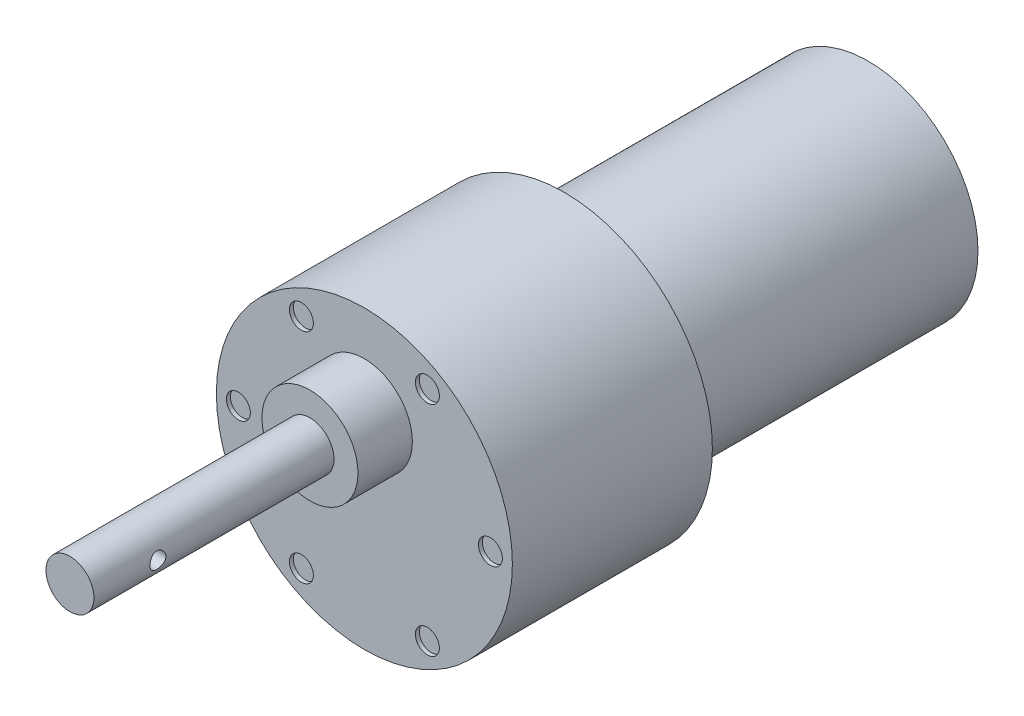
ISO-10303-21;
HEADER;
FILE_DESCRIPTION(('STEP AP214'),'2;1');
FILE_NAME('part.step','',(''),(''),'','','');
FILE_SCHEMA(('AUTOMOTIVE_DESIGN { 1 0 10303 214 1 1 1 1 }'));
ENDSEC;
DATA;
#1=APPLICATION_CONTEXT('core data for automotive mechanical design processes');
#2=APPLICATION_PROTOCOL_DEFINITION('international standard','automotive_design',2000,#1);
#3=PRODUCT_CONTEXT('',#1,'mechanical');
#4=PRODUCT('Part','Part','',(#3));
#5=PRODUCT_RELATED_PRODUCT_CATEGORY('part','',(#4));
#6=PRODUCT_DEFINITION_FORMATION('','',#4);
#7=PRODUCT_DEFINITION_CONTEXT('part definition',#1,'design');
#8=PRODUCT_DEFINITION('design','',#6,#7);
#9=PRODUCT_DEFINITION_SHAPE('','',#8);
#10=(LENGTH_UNIT() NAMED_UNIT(*) SI_UNIT(.MILLI.,.METRE.));
#11=(NAMED_UNIT(*) PLANE_ANGLE_UNIT() SI_UNIT($,.RADIAN.));
#12=(NAMED_UNIT(*) SI_UNIT($,.STERADIAN.) SOLID_ANGLE_UNIT());
#13=UNCERTAINTY_MEASURE_WITH_UNIT(LENGTH_MEASURE(1.E-05),#10,'distance_accuracy_value','');
#14=(GEOMETRIC_REPRESENTATION_CONTEXT(3) GLOBAL_UNCERTAINTY_ASSIGNED_CONTEXT((#13)) GLOBAL_UNIT_ASSIGNED_CONTEXT((#10,
#11,#12)) REPRESENTATION_CONTEXT('',''));
#15=CARTESIAN_POINT('',(0.,0.,0.));
#16=DIRECTION('',(0.,0.,1.));
#17=DIRECTION('',(1.,0.,0.));
#18=AXIS2_PLACEMENT_3D('',#15,#16,#17);
#19=CARTESIAN_POINT('',(0.,0.,38.));
#20=DIRECTION('',(0.,0.,-1.));
#21=DIRECTION('',(-1.,0.,0.));
#22=AXIS2_PLACEMENT_3D('',#19,#20,#21);
#23=CYLINDRICAL_SURFACE('',#22,13.7);
#24=CARTESIAN_POINT('',(0.,0.,38.));
#25=DIRECTION('',(0.,0.,1.));
#26=DIRECTION('',(1.,0.,0.));
#27=AXIS2_PLACEMENT_3D('',#24,#25,#26);
#28=CIRCLE('',#27,13.7);
#29=CARTESIAN_POINT('',(13.7,0.,38.));
#30=VERTEX_POINT('',#29);
#31=EDGE_CURVE('E10',#30,#30,#28,.T.);
#32=ORIENTED_EDGE('',*,*,#31,.F.);
#33=EDGE_LOOP('',(#32));
#34=FACE_BOUND('',#33,.T.);
#35=CARTESIAN_POINT('',(0.,0.,0.));
#36=DIRECTION('',(0.,0.,1.));
#37=DIRECTION('',(1.,0.,0.));
#38=AXIS2_PLACEMENT_3D('',#35,#36,#37);
#39=CIRCLE('',#38,13.7);
#40=CARTESIAN_POINT('',(13.7,0.,0.));
#41=VERTEX_POINT('',#40);
#42=EDGE_CURVE('E43',#41,#41,#39,.T.);
#43=ORIENTED_EDGE('',*,*,#42,.T.);
#44=EDGE_LOOP('',(#43));
#45=FACE_BOUND('',#44,.T.);
#46=ADVANCED_FACE('F32',(#34,#45),#23,.T.);
#47=CARTESIAN_POINT('',(0.,0.,0.));
#48=DIRECTION('',(0.,0.,1.));
#49=DIRECTION('',(1.,0.,0.));
#50=AXIS2_PLACEMENT_3D('',#47,#48,#49);
#51=PLANE('',#50);
#52=ORIENTED_EDGE('',*,*,#42,.F.);
#53=EDGE_LOOP('',(#52));
#54=FACE_BOUND('',#53,.T.);
#55=ADVANCED_FACE('F124',(#54),#51,.F.);
#56=CARTESIAN_POINT('',(0.,0.,63.));
#57=DIRECTION('',(0.,0.,-1.));
#58=DIRECTION('',(-1.,0.,0.));
#59=AXIS2_PLACEMENT_3D('',#56,#57,#58);
#60=CYLINDRICAL_SURFACE('',#59,18.5);
#61=CARTESIAN_POINT('',(0.,0.,63.));
#62=DIRECTION('',(0.,0.,1.));
#63=DIRECTION('',(1.,0.,0.));
#64=AXIS2_PLACEMENT_3D('',#61,#62,#63);
#65=CIRCLE('',#64,18.5);
#66=CARTESIAN_POINT('',(18.5,0.,63.));
#67=VERTEX_POINT('',#66);
#68=EDGE_CURVE('E48',#67,#67,#65,.T.);
#69=ORIENTED_EDGE('',*,*,#68,.F.);
#70=EDGE_LOOP('',(#69));
#71=FACE_BOUND('',#70,.T.);
#72=CARTESIAN_POINT('',(0.,0.,38.));
#73=DIRECTION('',(0.,0.,1.));
#74=DIRECTION('',(1.,0.,0.));
#75=AXIS2_PLACEMENT_3D('',#72,#73,#74);
#76=CIRCLE('',#75,18.5);
#77=CARTESIAN_POINT('',(18.5,0.,38.));
#78=VERTEX_POINT('',#77);
#79=EDGE_CURVE('E51',#78,#78,#76,.T.);
#80=ORIENTED_EDGE('',*,*,#79,.T.);
#81=EDGE_LOOP('',(#80));
#82=FACE_BOUND('',#81,.T.);
#83=ADVANCED_FACE('F129',(#71,#82),#60,.T.);
#84=CARTESIAN_POINT('',(0.,0.,63.));
#85=DIRECTION('',(0.,0.,1.));
#86=DIRECTION('',(1.,0.,0.));
#87=AXIS2_PLACEMENT_3D('',#84,#85,#86);
#88=PLANE('',#87);
#89=CARTESIAN_POINT('',(-7.87500000000016,-13.6399001096048,63.));
#90=DIRECTION('',(0.,0.,1.));
#91=DIRECTION('',(1.,0.,0.));
#92=AXIS2_PLACEMENT_3D('',#89,#90,#91);
#93=CIRCLE('',#92,1.5);
#94=CARTESIAN_POINT('',(-6.37500000000016,-13.6399001096048,63.));
#95=VERTEX_POINT('',#94);
#96=EDGE_CURVE('E206',#95,#95,#93,.T.);
#97=ORIENTED_EDGE('',*,*,#96,.F.);
#98=EDGE_LOOP('',(#97));
#99=FACE_BOUND('',#98,.T.);
#100=CARTESIAN_POINT('',(7.87499999999987,-13.639900109605,63.));
#101=DIRECTION('',(0.,0.,1.));
#102=DIRECTION('',(1.,0.,0.));
#103=AXIS2_PLACEMENT_3D('',#100,#101,#102);
#104=CIRCLE('',#103,1.5);
#105=CARTESIAN_POINT('',(9.37499999999987,-13.639900109605,63.));
#106=VERTEX_POINT('',#105);
#107=EDGE_CURVE('E200',#106,#106,#104,.T.);
#108=ORIENTED_EDGE('',*,*,#107,.F.);
#109=EDGE_LOOP('',(#108));
#110=FACE_BOUND('',#109,.T.);
#111=CARTESIAN_POINT('',(15.75,-1.09981662173559E-13,63.));
#112=DIRECTION('',(0.,0.,1.));
#113=DIRECTION('',(1.,0.,0.));
#114=AXIS2_PLACEMENT_3D('',#111,#112,#113);
#115=CIRCLE('',#114,1.5);
#116=CARTESIAN_POINT('',(17.25,-1.09981662173559E-13,63.));
#117=VERTEX_POINT('',#116);
#118=EDGE_CURVE('E194',#117,#117,#115,.T.);
#119=ORIENTED_EDGE('',*,*,#118,.F.);
#120=EDGE_LOOP('',(#119));
#121=FACE_BOUND('',#120,.T.);
#122=CARTESIAN_POINT('',(7.87500000000006,13.6399001096049,63.));
#123=DIRECTION('',(0.,0.,1.));
#124=DIRECTION('',(1.,0.,0.));
#125=AXIS2_PLACEMENT_3D('',#122,#123,#124);
#126=CIRCLE('',#125,1.5);
#127=CARTESIAN_POINT('',(9.37500000000007,13.6399001096049,63.));
#128=VERTEX_POINT('',#127);
#129=EDGE_CURVE('E188',#128,#128,#126,.T.);
#130=ORIENTED_EDGE('',*,*,#129,.F.);
#131=EDGE_LOOP('',(#130));
#132=FACE_BOUND('',#131,.T.);
#133=CARTESIAN_POINT('',(-7.87499999999997,13.6399001096049,63.));
#134=DIRECTION('',(0.,0.,1.));
#135=DIRECTION('',(1.,0.,0.));
#136=AXIS2_PLACEMENT_3D('',#133,#134,#135);
#137=CIRCLE('',#136,1.5);
#138=CARTESIAN_POINT('',(-6.37499999999997,13.6399001096049,63.));
#139=VERTEX_POINT('',#138);
#140=EDGE_CURVE('E182',#139,#139,#137,.T.);
#141=ORIENTED_EDGE('',*,*,#140,.F.);
#142=EDGE_LOOP('',(#141));
#143=FACE_BOUND('',#142,.T.);
#144=CARTESIAN_POINT('',(-15.75,0.,63.));
#145=DIRECTION('',(0.,0.,1.));
#146=DIRECTION('',(1.,0.,0.));
#147=AXIS2_PLACEMENT_3D('',#144,#145,#146);
#148=CIRCLE('',#147,1.5);
#149=CARTESIAN_POINT('',(-14.25,0.,63.));
#150=VERTEX_POINT('',#149);
#151=EDGE_CURVE('E176',#150,#150,#148,.T.);
#152=ORIENTED_EDGE('',*,*,#151,.F.);
#153=EDGE_LOOP('',(#152));
#154=FACE_BOUND('',#153,.T.);
#155=CARTESIAN_POINT('',(0.,7.,63.));
#156=DIRECTION('',(0.,0.,1.));
#157=DIRECTION('',(1.,0.,0.));
#158=AXIS2_PLACEMENT_3D('',#155,#156,#157);
#159=CIRCLE('',#158,6.);
#160=CARTESIAN_POINT('',(6.,7.,63.));
#161=VERTEX_POINT('',#160);
#162=EDGE_CURVE('E160',#161,#161,#159,.T.);
#163=ORIENTED_EDGE('',*,*,#162,.F.);
#164=EDGE_LOOP('',(#163));
#165=FACE_BOUND('',#164,.T.);
#166=ORIENTED_EDGE('',*,*,#68,.T.);
#167=EDGE_LOOP('',(#166));
#168=FACE_BOUND('',#167,.T.);
#169=ADVANCED_FACE('F136',(#99,#110,#121,#132,#143,#154,#165,#168),#88,.T.);
#170=CARTESIAN_POINT('',(0.,0.,38.));
#171=DIRECTION('',(0.,0.,1.));
#172=DIRECTION('',(1.,0.,0.));
#173=AXIS2_PLACEMENT_3D('',#170,#171,#172);
#174=PLANE('',#173);
#175=ORIENTED_EDGE('',*,*,#31,.T.);
#176=EDGE_LOOP('',(#175));
#177=FACE_BOUND('',#176,.T.);
#178=ORIENTED_EDGE('',*,*,#79,.F.);
#179=EDGE_LOOP('',(#178));
#180=FACE_BOUND('',#179,.T.);
#181=ADVANCED_FACE('F140',(#177,#180),#174,.F.);
#182=CARTESIAN_POINT('',(0.,7.,69.8));
#183=DIRECTION('',(0.,0.,-1.));
#184=DIRECTION('',(-1.,0.,0.));
#185=AXIS2_PLACEMENT_3D('',#182,#183,#184);
#186=CYLINDRICAL_SURFACE('',#185,6.);
#187=CARTESIAN_POINT('',(0.,7.,69.8));
#188=DIRECTION('',(0.,0.,1.));
#189=DIRECTION('',(1.,0.,0.));
#190=AXIS2_PLACEMENT_3D('',#187,#188,#189);
#191=CIRCLE('',#190,6.);
#192=CARTESIAN_POINT('',(6.,7.,69.8));
#193=VERTEX_POINT('',#192);
#194=EDGE_CURVE('E159',#193,#193,#191,.T.);
#195=ORIENTED_EDGE('',*,*,#194,.F.);
#196=EDGE_LOOP('',(#195));
#197=FACE_BOUND('',#196,.T.);
#198=ORIENTED_EDGE('',*,*,#162,.T.);
#199=EDGE_LOOP('',(#198));
#200=FACE_BOUND('',#199,.T.);
#201=ADVANCED_FACE('F143',(#197,#200),#186,.T.);
#202=CARTESIAN_POINT('',(0.,7.,69.8));
#203=DIRECTION('',(0.,0.,1.));
#204=DIRECTION('',(1.,0.,0.));
#205=AXIS2_PLACEMENT_3D('',#202,#203,#204);
#206=PLANE('',#205);
#207=CARTESIAN_POINT('',(0.,7.,69.8));
#208=DIRECTION('',(0.,0.,1.));
#209=DIRECTION('',(1.,0.,0.));
#210=AXIS2_PLACEMENT_3D('',#207,#208,#209);
#211=CIRCLE('',#210,3.);
#212=CARTESIAN_POINT('',(3.,7.,69.8));
#213=VERTEX_POINT('',#212);
#214=EDGE_CURVE('E156',#213,#213,#211,.T.);
#215=ORIENTED_EDGE('',*,*,#214,.F.);
#216=EDGE_LOOP('',(#215));
#217=FACE_BOUND('',#216,.T.);
#218=ORIENTED_EDGE('',*,*,#194,.T.);
#219=EDGE_LOOP('',(#218));
#220=FACE_BOUND('',#219,.T.);
#221=ADVANCED_FACE('F120',(#217,#220),#206,.T.);
#222=CARTESIAN_POINT('',(0.,7.,99.8));
#223=DIRECTION('',(0.,0.,-1.));
#224=DIRECTION('',(-1.,0.,0.));
#225=AXIS2_PLACEMENT_3D('',#222,#223,#224);
#226=CYLINDRICAL_SURFACE('',#225,3.);
#227=CARTESIAN_POINT('',(-3.,7.,92.8));
#228=CARTESIAN_POINT('',(-3.00000015300943,6.94543663711328,92.8000002537316));
#229=CARTESIAN_POINT('',(-2.99849769507545,6.89087480546145,92.7955197338728));
#230=CARTESIAN_POINT('',(-2.99265210203281,6.78335823912703,92.7777708911828));
#231=CARTESIAN_POINT('',(-2.98830867202153,6.73040367188118,92.7645016560511));
#232=CARTESIAN_POINT('',(-2.97725307906443,6.62766721049823,92.7296807566159));
#233=CARTESIAN_POINT('',(-2.97054487730853,6.57788017411397,92.7081429375407));
#234=CARTESIAN_POINT('',(-2.95544445717342,6.48262506319468,92.6574588271616));
#235=CARTESIAN_POINT('',(-2.94705190667778,6.43715784304129,92.6283110349974));
#236=CARTESIAN_POINT('',(-2.92914094443005,6.35025832497774,92.5621741951413));
#237=CARTESIAN_POINT('',(-2.91959556463785,6.3089962997017,92.5249687657395));
#238=CARTESIAN_POINT('',(-2.90060314783122,6.23316730729792,92.4442328452934));
#239=CARTESIAN_POINT('',(-2.89115613290549,6.19860181451054,92.4007009650715));
#240=CARTESIAN_POINT('',(-2.87313332477274,6.13617505777214,92.3070148848035));
#241=CARTESIAN_POINT('',(-2.86459039275688,6.10853514177897,92.2567062602679));
#242=CARTESIAN_POINT('',(-2.84975305418601,6.06218112612228,92.1518239055414));
#243=CARTESIAN_POINT('',(-2.84345796160746,6.04346430261324,92.0972514828373));
#244=CARTESIAN_POINT('',(-2.83411303269377,6.01612653849084,91.9873267785033));
#245=CARTESIAN_POINT('',(-2.83096095769611,6.00718655172823,91.9320627915109));
#246=CARTESIAN_POINT('',(-2.82795656629508,5.99865887666552,91.8207362458441));
#247=CARTESIAN_POINT('',(-2.8281032302273,5.99906829839528,91.7646739392908));
#248=CARTESIAN_POINT('',(-2.8315901500818,6.00898009629658,91.656063369556));
#249=CARTESIAN_POINT('',(-2.83478415867533,6.01806608683301,91.603471597081));
#250=CARTESIAN_POINT('',(-2.84376657724551,6.04439383715059,91.5006065803932));
#251=CARTESIAN_POINT('',(-2.84955529784108,6.06163657340813,91.4503336145649));
#252=CARTESIAN_POINT('',(-2.86317911131249,6.10406094193979,91.3525872504085));
#253=CARTESIAN_POINT('',(-2.87104565793117,6.12936595129274,91.3051719745305));
#254=CARTESIAN_POINT('',(-2.88792558575726,6.18711089369686,91.2151290917203));
#255=CARTESIAN_POINT('',(-2.89693929790464,6.219552887636,91.1725028730666));
#256=CARTESIAN_POINT('',(-2.91567329167741,6.29265066731776,91.0909084018392));
#257=CARTESIAN_POINT('',(-2.92540589354843,6.33364684992369,91.0522473054909));
#258=CARTESIAN_POINT('',(-2.94406938387037,6.42166043002994,90.9822687333366));
#259=CARTESIAN_POINT('',(-2.95300019538067,6.46867840433919,90.9509519618355));
#260=CARTESIAN_POINT('',(-2.96917107937794,6.56805238695374,90.8963036997649));
#261=CARTESIAN_POINT('',(-2.97639350008039,6.62045672358366,90.8730545086593));
#262=CARTESIAN_POINT('',(-2.98820567144435,6.72873091663549,90.8357968260443));
#263=CARTESIAN_POINT('',(-2.99279633654878,6.78459956184504,90.8217851245766));
#264=CARTESIAN_POINT('',(-2.99867627071441,6.89561617047069,90.8039443339777));
#265=CARTESIAN_POINT('',(-3.00010001833731,6.95069040013515,90.7997001908273));
#266=CARTESIAN_POINT('',(-2.99988902694825,7.06077506996023,90.8003326735985));
#267=CARTESIAN_POINT('',(-2.99825480419352,7.11578551931965,90.8052077599799));
#268=CARTESIAN_POINT('',(-2.99220024717114,7.22251986630426,90.823611907736));
#269=CARTESIAN_POINT('',(-2.98786198711228,7.27429280683486,90.8368862060495));
#270=CARTESIAN_POINT('',(-2.97691846830034,7.37485595857956,90.8713934444667));
#271=CARTESIAN_POINT('',(-2.97031292046541,7.42364578850856,90.8926273994677));
#272=CARTESIAN_POINT('',(-2.95528931287427,7.51828829639332,90.9430704318409));
#273=CARTESIAN_POINT('',(-2.94682814756305,7.56402995921733,90.9724745932836));
#274=CARTESIAN_POINT('',(-2.92905253915743,7.6500648301354,91.038194150013));
#275=CARTESIAN_POINT('',(-2.91973783591888,7.69035636779489,91.0745116560302));
#276=CARTESIAN_POINT('',(-2.90076847982472,7.76625250780701,91.1549787510083));
#277=CARTESIAN_POINT('',(-2.89111761095155,7.80156096924849,91.1994092269332));
#278=CARTESIAN_POINT('',(-2.87299973286981,7.86425752232085,91.2937715678045));
#279=CARTESIAN_POINT('',(-2.8645327335312,7.89164554792084,91.3437034786102));
#280=CARTESIAN_POINT('',(-2.84982391820308,7.93759693042336,91.4476730153066));
#281=CARTESIAN_POINT('',(-2.84357760900632,7.95617813219776,91.5017020792428));
#282=CARTESIAN_POINT('',(-2.83410832399133,7.98389466679216,91.6123786501241));
#283=CARTESIAN_POINT('',(-2.83088398622698,7.99303425496124,91.669024965433));
#284=CARTESIAN_POINT('',(-2.82797858875071,8.00127628247038,91.7801970960132));
#285=CARTESIAN_POINT('',(-2.82812400344299,8.00087025731093,91.8346823402517));
#286=CARTESIAN_POINT('',(-2.8315126992356,7.99124229345488,91.9427650748997));
#287=CARTESIAN_POINT('',(-2.83475579595884,7.98202087945889,91.9963626179529));
#288=CARTESIAN_POINT('',(-2.84384524278943,7.95537181312698,92.1001356630127));
#289=CARTESIAN_POINT('',(-2.84964098015514,7.93810334601488,92.1503568250072));
#290=CARTESIAN_POINT('',(-2.86316398825434,7.89597936576038,92.2472274069355));
#291=CARTESIAN_POINT('',(-2.87089168765297,7.87112216855397,92.2938760311873));
#292=CARTESIAN_POINT('',(-2.8878282922406,7.81326069258324,92.3844836699237));
#293=CARTESIAN_POINT('',(-2.89708711641604,7.77994824276453,92.4282365018986));
#294=CARTESIAN_POINT('',(-2.91583356283786,7.7066428831357,92.509689813384));
#295=CARTESIAN_POINT('',(-2.92532124912518,7.6666480844515,92.547388575688));
#296=CARTESIAN_POINT('',(-2.94390030525393,7.57924155692068,92.6171444122892));
#297=CARTESIAN_POINT('',(-2.95296181801216,7.53160151349972,92.648924347751));
#298=CARTESIAN_POINT('',(-2.96925991172652,7.43135735740663,92.7039904288506));
#299=CARTESIAN_POINT('',(-2.9764969590794,7.37875451813235,92.727278745922));
#300=CARTESIAN_POINT('',(-2.98805515068532,7.27249364720097,92.7637216324887));
#301=CARTESIAN_POINT('',(-2.9924921242252,7.21898775767641,92.7772824662634));
#302=CARTESIAN_POINT('',(-2.99846407064225,7.11032041601025,92.7954202806771));
#303=CARTESIAN_POINT('',(-2.99999984531906,7.05515942556875,92.7999997434965));
#304=CARTESIAN_POINT('',(-3.,7.,92.8));
#305=B_SPLINE_CURVE_WITH_KNOTS('',3,(#227,#228,#229,#230,#231,#232,#233,#234,#235,#236,#237,
#238,#239,#240,#241,#242,#243,#244,#245,#246,#247,#248,#249,#250,#251,#252,#253,#254,#255,#256,
#257,#258,#259,#260,#261,#262,#263,#264,#265,#266,#267,#268,#269,#270,#271,#272,#273,#274,#275,
#276,#277,#278,#279,#280,#281,#282,#283,#284,#285,#286,#287,#288,#289,#290,#291,#292,#293,#294,
#295,#296,#297,#298,#299,#300,#301,#302,#303,#304),.UNSPECIFIED.,.T.,.F.,(4,2,2,2,2,2,2,2,2,2,2,
2,2,2,2,2,2,2,2,2,2,2,2,2,2,2,2,2,2,2,2,2,2,2,2,2,2,2,4),(0.,0.163487106026012,0.32699118526752,
0.490222672870267,0.653486377799098,0.821846842827545,0.990244332875297,1.1634838482347,
1.33667044692833,1.50401925741839,1.67131633987485,1.83096826551281,1.99063930855482,
2.15288171155131,2.31517102558207,2.48593305811367,2.65671145966619,2.82918405650357,
3.00159668877208,3.16653583175169,3.33144713164176,3.49158157978213,3.65173645284104,
3.81610399843736,3.98052180821891,4.15241022880751,4.32430008234996,4.49584013824415,
4.66730284700844,4.82995666056617,4.99260079341184,5.15215587070227,5.31174638165788,
5.47830066681614,5.64490211113588,5.81799660824909,5.99104681142266,6.15636558363623,
6.32163866027949),.UNSPECIFIED.);
#306=CARTESIAN_POINT('',(-3.,7.,92.8));
#307=VERTEX_POINT('',#306);
#308=EDGE_CURVE('E35',#307,#307,#305,.T.);
#309=ORIENTED_EDGE('',*,*,#308,.T.);
#310=EDGE_LOOP('',(#309));
#311=FACE_BOUND('',#310,.T.);
#312=CARTESIAN_POINT('',(3.,7.,90.8));
#313=CARTESIAN_POINT('',(3.00000015300943,6.94543663711328,90.7999997462684));
#314=CARTESIAN_POINT('',(2.99849769507545,6.89087480546145,90.8044802661272));
#315=CARTESIAN_POINT('',(2.99265210203281,6.78335823912703,90.8222291088172));
#316=CARTESIAN_POINT('',(2.98830867202153,6.73040367188118,90.8354983439489));
#317=CARTESIAN_POINT('',(2.97725307906443,6.62766721049823,90.870319243384));
#318=CARTESIAN_POINT('',(2.97054487730853,6.57788017411397,90.8918570624593));
#319=CARTESIAN_POINT('',(2.95544445717342,6.48262506319468,90.9425411728383));
#320=CARTESIAN_POINT('',(2.94705190667778,6.43715784304129,90.9716889650026));
#321=CARTESIAN_POINT('',(2.92914094443005,6.35025832497773,91.0378258048587));
#322=CARTESIAN_POINT('',(2.91959556463785,6.30899629970169,91.0750312342605));
#323=CARTESIAN_POINT('',(2.90060314783122,6.23316730729792,91.1557671547066));
#324=CARTESIAN_POINT('',(2.89115613290549,6.19860181451054,91.1992990349285));
#325=CARTESIAN_POINT('',(2.87313332477274,6.13617505777214,91.2929851151964));
#326=CARTESIAN_POINT('',(2.86459039275688,6.10853514177897,91.3432937397321));
#327=CARTESIAN_POINT('',(2.84975305418601,6.06218112612228,91.4481760944585));
#328=CARTESIAN_POINT('',(2.84345796160746,6.04346430261324,91.5027485171627));
#329=CARTESIAN_POINT('',(2.83411303269377,6.01612653849084,91.6126732214967));
#330=CARTESIAN_POINT('',(2.83096095769611,6.00718655172823,91.6679372084891));
#331=CARTESIAN_POINT('',(2.82795656629508,5.99865887666552,91.7792637541559));
#332=CARTESIAN_POINT('',(2.8281032302273,5.99906829839528,91.8353260607092));
#333=CARTESIAN_POINT('',(2.8315901500818,6.00898009629658,91.943936630444));
#334=CARTESIAN_POINT('',(2.83478415867533,6.01806608683301,91.996528402919));
#335=CARTESIAN_POINT('',(2.84376657724551,6.04439383715059,92.0993934196068));
#336=CARTESIAN_POINT('',(2.84955529784108,6.06163657340813,92.1496663854351));
#337=CARTESIAN_POINT('',(2.86317911131249,6.10406094193979,92.2474127495915));
#338=CARTESIAN_POINT('',(2.87104565793117,6.12936595129274,92.2948280254695));
#339=CARTESIAN_POINT('',(2.88792558575726,6.18711089369686,92.3848709082797));
#340=CARTESIAN_POINT('',(2.89693929790464,6.219552887636,92.4274971269334));
#341=CARTESIAN_POINT('',(2.91567329167741,6.29265066731776,92.5090915981608));
#342=CARTESIAN_POINT('',(2.92540589354843,6.33364684992369,92.5477526945091));
#343=CARTESIAN_POINT('',(2.94406938387037,6.42166043002994,92.6177312666634));
#344=CARTESIAN_POINT('',(2.95300019538067,6.46867840433919,92.6490480381645));
#345=CARTESIAN_POINT('',(2.96917107937794,6.56805238695374,92.7036963002351));
#346=CARTESIAN_POINT('',(2.97639350008039,6.62045672358366,92.7269454913407));
#347=CARTESIAN_POINT('',(2.98820567144435,6.72873091663549,92.7642031739557));
#348=CARTESIAN_POINT('',(2.99279633654878,6.78459956184504,92.7782148754234));
#349=CARTESIAN_POINT('',(2.99867627071441,6.89561617047069,92.7960556660223));
#350=CARTESIAN_POINT('',(3.00010001833731,6.95069040013515,92.8002998091727));
#351=CARTESIAN_POINT('',(2.99988902694825,7.06077506996023,92.7996673264015));
#352=CARTESIAN_POINT('',(2.99825480419352,7.11578551931965,92.7947922400201));
#353=CARTESIAN_POINT('',(2.99220024717114,7.22251986630426,92.776388092264));
#354=CARTESIAN_POINT('',(2.98786198711228,7.27429280683486,92.7631137939505));
#355=CARTESIAN_POINT('',(2.97691846830034,7.37485595857956,92.7286065555333));
#356=CARTESIAN_POINT('',(2.97031292046541,7.42364578850856,92.7073726005323));
#357=CARTESIAN_POINT('',(2.95528931287427,7.51828829639332,92.6569295681591));
#358=CARTESIAN_POINT('',(2.94682814756305,7.56402995921733,92.6275254067164));
#359=CARTESIAN_POINT('',(2.92905253915743,7.6500648301354,92.5618058499869));
#360=CARTESIAN_POINT('',(2.91973783591888,7.69035636779489,92.5254883439698));
#361=CARTESIAN_POINT('',(2.90076847982472,7.76625250780701,92.4450212489917));
#362=CARTESIAN_POINT('',(2.89111761095155,7.80156096924849,92.4005907730667));
#363=CARTESIAN_POINT('',(2.87299973286981,7.86425752232085,92.3062284321955));
#364=CARTESIAN_POINT('',(2.8645327335312,7.89164554792084,92.2562965213898));
#365=CARTESIAN_POINT('',(2.84982391820308,7.93759693042336,92.1523269846934));
#366=CARTESIAN_POINT('',(2.84357760900632,7.95617813219776,92.0982979207572));
#367=CARTESIAN_POINT('',(2.83410832399133,7.98389466679216,91.9876213498759));
#368=CARTESIAN_POINT('',(2.83088398622698,7.99303425496124,91.9309750345669));
#369=CARTESIAN_POINT('',(2.82797858875071,8.00127628247038,91.8198029039868));
#370=CARTESIAN_POINT('',(2.82812400344299,8.00087025731093,91.7653176597483));
#371=CARTESIAN_POINT('',(2.8315126992356,7.99124229345488,91.6572349251003));
#372=CARTESIAN_POINT('',(2.83475579595884,7.98202087945889,91.6036373820471));
#373=CARTESIAN_POINT('',(2.84384524278943,7.95537181312698,91.4998643369873));
#374=CARTESIAN_POINT('',(2.84964098015514,7.93810334601488,91.4496431749928));
#375=CARTESIAN_POINT('',(2.86316398825434,7.89597936576038,91.3527725930645));
#376=CARTESIAN_POINT('',(2.87089168765297,7.87112216855397,91.3061239688127));
#377=CARTESIAN_POINT('',(2.8878282922406,7.81326069258324,91.2155163300763));
#378=CARTESIAN_POINT('',(2.89708711641604,7.77994824276453,91.1717634981014));
#379=CARTESIAN_POINT('',(2.91583356283786,7.7066428831357,91.090310186616));
#380=CARTESIAN_POINT('',(2.92532124912518,7.6666480844515,91.052611424312));
#381=CARTESIAN_POINT('',(2.94390030525393,7.57924155692068,90.9828555877108));
#382=CARTESIAN_POINT('',(2.95296181801216,7.53160151349972,90.951075652249));
#383=CARTESIAN_POINT('',(2.96925991172652,7.43135735740663,90.8960095711494));
#384=CARTESIAN_POINT('',(2.9764969590794,7.37875451813235,90.872721254078));
#385=CARTESIAN_POINT('',(2.98805515068532,7.27249364720097,90.8362783675113));
#386=CARTESIAN_POINT('',(2.9924921242252,7.21898775767641,90.8227175337366));
#387=CARTESIAN_POINT('',(2.99846407064225,7.11032041601025,90.8045797193229));
#388=CARTESIAN_POINT('',(2.99999984531906,7.05515942556875,90.8000002565035));
#389=CARTESIAN_POINT('',(3.,7.,90.8));
#390=B_SPLINE_CURVE_WITH_KNOTS('',3,(#312,#313,#314,#315,#316,#317,#318,#319,#320,#321,#322,
#323,#324,#325,#326,#327,#328,#329,#330,#331,#332,#333,#334,#335,#336,#337,#338,#339,#340,#341,
#342,#343,#344,#345,#346,#347,#348,#349,#350,#351,#352,#353,#354,#355,#356,#357,#358,#359,#360,
#361,#362,#363,#364,#365,#366,#367,#368,#369,#370,#371,#372,#373,#374,#375,#376,#377,#378,#379,
#380,#381,#382,#383,#384,#385,#386,#387,#388,#389),.UNSPECIFIED.,.T.,.F.,(4,2,2,2,2,2,2,2,2,2,2,
2,2,2,2,2,2,2,2,2,2,2,2,2,2,2,2,2,2,2,2,2,2,2,2,2,2,2,4),(0.,0.163487106026012,0.32699118526752,
0.490222672870267,0.653486377799098,0.821846842827559,0.990244332875296,1.1634838482347,
1.33667044692833,1.50401925741839,1.67131633987485,1.83096826551281,1.99063930855482,
2.15288171155131,2.31517102558207,2.48593305811367,2.65671145966619,2.82918405650357,
3.00159668877208,3.16653583175169,3.33144713164176,3.49158157978213,3.65173645284103,
3.81610399843736,3.98052180821891,4.15241022880751,4.32430008234996,4.49584013824415,
4.66730284700844,4.82995666056617,4.99260079341184,5.15215587070227,5.31174638165788,
5.47830066681614,5.64490211113588,5.81799660824909,5.99104681142266,6.15636558363623,
6.32163866027949),.UNSPECIFIED.);
#391=CARTESIAN_POINT('',(3.,7.,90.8));
#392=VERTEX_POINT('',#391);
#393=EDGE_CURVE('E53',#392,#392,#390,.T.);
#394=ORIENTED_EDGE('',*,*,#393,.T.);
#395=EDGE_LOOP('',(#394));
#396=FACE_BOUND('',#395,.T.);
#397=CARTESIAN_POINT('',(0.,7.,99.8));
#398=DIRECTION('',(0.,0.,1.));
#399=DIRECTION('',(1.,0.,0.));
#400=AXIS2_PLACEMENT_3D('',#397,#398,#399);
#401=CIRCLE('',#400,3.);
#402=CARTESIAN_POINT('',(3.,7.,99.8));
#403=VERTEX_POINT('',#402);
#404=EDGE_CURVE('E164',#403,#403,#401,.T.);
#405=ORIENTED_EDGE('',*,*,#404,.F.);
#406=EDGE_LOOP('',(#405));
#407=FACE_BOUND('',#406,.T.);
#408=ORIENTED_EDGE('',*,*,#214,.T.);
#409=EDGE_LOOP('',(#408));
#410=FACE_BOUND('',#409,.T.);
#411=ADVANCED_FACE('F57',(#311,#396,#407,#410),#226,.T.);
#412=CARTESIAN_POINT('',(0.,7.,99.8));
#413=DIRECTION('',(0.,0.,1.));
#414=DIRECTION('',(1.,0.,0.));
#415=AXIS2_PLACEMENT_3D('',#412,#413,#414);
#416=PLANE('',#415);
#417=ORIENTED_EDGE('',*,*,#404,.T.);
#418=EDGE_LOOP('',(#417));
#419=FACE_BOUND('',#418,.T.);
#420=ADVANCED_FACE('F113',(#419),#416,.T.);
#421=CARTESIAN_POINT('',(-15.75,0.,62.5));
#422=DIRECTION('',(0.,0.,1.));
#423=DIRECTION('',(1.,0.,0.));
#424=AXIS2_PLACEMENT_3D('',#421,#422,#423);
#425=CYLINDRICAL_SURFACE('',#424,1.5);
#426=CARTESIAN_POINT('',(-15.75,0.,62.5));
#427=DIRECTION('',(0.,0.,1.));
#428=DIRECTION('',(1.,0.,0.));
#429=AXIS2_PLACEMENT_3D('',#426,#427,#428);
#430=CIRCLE('',#429,1.5);
#431=CARTESIAN_POINT('',(-14.25,0.,62.5));
#432=VERTEX_POINT('',#431);
#433=EDGE_CURVE('E174',#432,#432,#430,.T.);
#434=ORIENTED_EDGE('',*,*,#433,.F.);
#435=EDGE_LOOP('',(#434));
#436=FACE_BOUND('',#435,.T.);
#437=ORIENTED_EDGE('',*,*,#151,.T.);
#438=EDGE_LOOP('',(#437));
#439=FACE_BOUND('',#438,.T.);
#440=ADVANCED_FACE('F110',(#436,#439),#425,.F.);
#441=CARTESIAN_POINT('',(-15.75,0.,62.5));
#442=DIRECTION('',(0.,0.,1.));
#443=DIRECTION('',(1.,0.,0.));
#444=AXIS2_PLACEMENT_3D('',#441,#442,#443);
#445=PLANE('',#444);
#446=ORIENTED_EDGE('',*,*,#433,.T.);
#447=EDGE_LOOP('',(#446));
#448=FACE_BOUND('',#447,.T.);
#449=ADVANCED_FACE('F106',(#448),#445,.T.);
#450=CARTESIAN_POINT('',(-7.87499999999997,13.6399001096049,62.5));
#451=DIRECTION('',(0.,0.,1.));
#452=DIRECTION('',(1.,0.,0.));
#453=AXIS2_PLACEMENT_3D('',#450,#451,#452);
#454=CYLINDRICAL_SURFACE('',#453,1.5);
#455=CARTESIAN_POINT('',(-7.87499999999997,13.6399001096049,62.5));
#456=DIRECTION('',(0.,0.,1.));
#457=DIRECTION('',(1.,0.,0.));
#458=AXIS2_PLACEMENT_3D('',#455,#456,#457);
#459=CIRCLE('',#458,1.5);
#460=CARTESIAN_POINT('',(-6.37499999999997,13.6399001096049,62.5));
#461=VERTEX_POINT('',#460);
#462=EDGE_CURVE('E179',#461,#461,#459,.T.);
#463=ORIENTED_EDGE('',*,*,#462,.F.);
#464=EDGE_LOOP('',(#463));
#465=FACE_BOUND('',#464,.T.);
#466=ORIENTED_EDGE('',*,*,#140,.T.);
#467=EDGE_LOOP('',(#466));
#468=FACE_BOUND('',#467,.T.);
#469=ADVANCED_FACE('F102',(#465,#468),#454,.F.);
#470=CARTESIAN_POINT('',(-7.87499999999997,13.6399001096049,62.5));
#471=DIRECTION('',(0.,0.,1.));
#472=DIRECTION('',(1.,0.,0.));
#473=AXIS2_PLACEMENT_3D('',#470,#471,#472);
#474=PLANE('',#473);
#475=ORIENTED_EDGE('',*,*,#462,.T.);
#476=EDGE_LOOP('',(#475));
#477=FACE_BOUND('',#476,.T.);
#478=ADVANCED_FACE('F98',(#477),#474,.T.);
#479=CARTESIAN_POINT('',(7.87500000000006,13.6399001096049,62.5));
#480=DIRECTION('',(0.,0.,1.));
#481=DIRECTION('',(1.,0.,0.));
#482=AXIS2_PLACEMENT_3D('',#479,#480,#481);
#483=CYLINDRICAL_SURFACE('',#482,1.5);
#484=CARTESIAN_POINT('',(7.87500000000006,13.6399001096049,62.5));
#485=DIRECTION('',(0.,0.,1.));
#486=DIRECTION('',(1.,0.,0.));
#487=AXIS2_PLACEMENT_3D('',#484,#485,#486);
#488=CIRCLE('',#487,1.5);
#489=CARTESIAN_POINT('',(9.37500000000007,13.6399001096049,62.5));
#490=VERTEX_POINT('',#489);
#491=EDGE_CURVE('E185',#490,#490,#488,.T.);
#492=ORIENTED_EDGE('',*,*,#491,.F.);
#493=EDGE_LOOP('',(#492));
#494=FACE_BOUND('',#493,.T.);
#495=ORIENTED_EDGE('',*,*,#129,.T.);
#496=EDGE_LOOP('',(#495));
#497=FACE_BOUND('',#496,.T.);
#498=ADVANCED_FACE('F94',(#494,#497),#483,.F.);
#499=CARTESIAN_POINT('',(7.87500000000006,13.6399001096049,62.5));
#500=DIRECTION('',(0.,0.,1.));
#501=DIRECTION('',(1.,0.,0.));
#502=AXIS2_PLACEMENT_3D('',#499,#500,#501);
#503=PLANE('',#502);
#504=ORIENTED_EDGE('',*,*,#491,.T.);
#505=EDGE_LOOP('',(#504));
#506=FACE_BOUND('',#505,.T.);
#507=ADVANCED_FACE('F90',(#506),#503,.T.);
#508=CARTESIAN_POINT('',(15.75,-1.09981662173559E-13,62.5));
#509=DIRECTION('',(0.,0.,1.));
#510=DIRECTION('',(1.,0.,0.));
#511=AXIS2_PLACEMENT_3D('',#508,#509,#510);
#512=CYLINDRICAL_SURFACE('',#511,1.5);
#513=CARTESIAN_POINT('',(15.75,-1.09981662173559E-13,62.5));
#514=DIRECTION('',(0.,0.,1.));
#515=DIRECTION('',(1.,0.,0.));
#516=AXIS2_PLACEMENT_3D('',#513,#514,#515);
#517=CIRCLE('',#516,1.5);
#518=CARTESIAN_POINT('',(17.25,-1.09981662173559E-13,62.5));
#519=VERTEX_POINT('',#518);
#520=EDGE_CURVE('E191',#519,#519,#517,.T.);
#521=ORIENTED_EDGE('',*,*,#520,.F.);
#522=EDGE_LOOP('',(#521));
#523=FACE_BOUND('',#522,.T.);
#524=ORIENTED_EDGE('',*,*,#118,.T.);
#525=EDGE_LOOP('',(#524));
#526=FACE_BOUND('',#525,.T.);
#527=ADVANCED_FACE('F86',(#523,#526),#512,.F.);
#528=CARTESIAN_POINT('',(15.75,-1.09981662173559E-13,62.5));
#529=DIRECTION('',(0.,0.,1.));
#530=DIRECTION('',(1.,0.,0.));
#531=AXIS2_PLACEMENT_3D('',#528,#529,#530);
#532=PLANE('',#531);
#533=ORIENTED_EDGE('',*,*,#520,.T.);
#534=EDGE_LOOP('',(#533));
#535=FACE_BOUND('',#534,.T.);
#536=ADVANCED_FACE('F82',(#535),#532,.T.);
#537=CARTESIAN_POINT('',(7.87499999999987,-13.639900109605,62.5));
#538=DIRECTION('',(0.,0.,1.));
#539=DIRECTION('',(1.,0.,0.));
#540=AXIS2_PLACEMENT_3D('',#537,#538,#539);
#541=CYLINDRICAL_SURFACE('',#540,1.5);
#542=CARTESIAN_POINT('',(7.87499999999987,-13.639900109605,62.5));
#543=DIRECTION('',(0.,0.,1.));
#544=DIRECTION('',(1.,0.,0.));
#545=AXIS2_PLACEMENT_3D('',#542,#543,#544);
#546=CIRCLE('',#545,1.5);
#547=CARTESIAN_POINT('',(9.37499999999987,-13.639900109605,62.5));
#548=VERTEX_POINT('',#547);
#549=EDGE_CURVE('E197',#548,#548,#546,.T.);
#550=ORIENTED_EDGE('',*,*,#549,.F.);
#551=EDGE_LOOP('',(#550));
#552=FACE_BOUND('',#551,.T.);
#553=ORIENTED_EDGE('',*,*,#107,.T.);
#554=EDGE_LOOP('',(#553));
#555=FACE_BOUND('',#554,.T.);
#556=ADVANCED_FACE('F78',(#552,#555),#541,.F.);
#557=CARTESIAN_POINT('',(7.87499999999987,-13.639900109605,62.5));
#558=DIRECTION('',(0.,0.,1.));
#559=DIRECTION('',(1.,0.,0.));
#560=AXIS2_PLACEMENT_3D('',#557,#558,#559);
#561=PLANE('',#560);
#562=ORIENTED_EDGE('',*,*,#549,.T.);
#563=EDGE_LOOP('',(#562));
#564=FACE_BOUND('',#563,.T.);
#565=ADVANCED_FACE('F74',(#564),#561,.T.);
#566=CARTESIAN_POINT('',(-7.87500000000016,-13.6399001096048,62.5));
#567=DIRECTION('',(0.,0.,1.));
#568=DIRECTION('',(1.,0.,0.));
#569=AXIS2_PLACEMENT_3D('',#566,#567,#568);
#570=CYLINDRICAL_SURFACE('',#569,1.5);
#571=CARTESIAN_POINT('',(-7.87500000000016,-13.6399001096048,62.5));
#572=DIRECTION('',(0.,0.,1.));
#573=DIRECTION('',(1.,0.,0.));
#574=AXIS2_PLACEMENT_3D('',#571,#572,#573);
#575=CIRCLE('',#574,1.5);
#576=CARTESIAN_POINT('',(-6.37500000000016,-13.6399001096048,62.5));
#577=VERTEX_POINT('',#576);
#578=EDGE_CURVE('E203',#577,#577,#575,.T.);
#579=ORIENTED_EDGE('',*,*,#578,.F.);
#580=EDGE_LOOP('',(#579));
#581=FACE_BOUND('',#580,.T.);
#582=ORIENTED_EDGE('',*,*,#96,.T.);
#583=EDGE_LOOP('',(#582));
#584=FACE_BOUND('',#583,.T.);
#585=ADVANCED_FACE('F70',(#581,#584),#570,.F.);
#586=CARTESIAN_POINT('',(-7.87500000000016,-13.6399001096048,62.5));
#587=DIRECTION('',(0.,0.,1.));
#588=DIRECTION('',(1.,0.,0.));
#589=AXIS2_PLACEMENT_3D('',#586,#587,#588);
#590=PLANE('',#589);
#591=ORIENTED_EDGE('',*,*,#578,.T.);
#592=EDGE_LOOP('',(#591));
#593=FACE_BOUND('',#592,.T.);
#594=ADVANCED_FACE('F65',(#593),#590,.T.);
#595=CARTESIAN_POINT('',(-18.5,7.,91.8));
#596=DIRECTION('',(1.,0.,0.));
#597=DIRECTION('',(0.,0.,-1.));
#598=AXIS2_PLACEMENT_3D('',#595,#596,#597);
#599=CYLINDRICAL_SURFACE('',#598,0.999999999999998);
#600=ORIENTED_EDGE('',*,*,#393,.F.);
#601=EDGE_LOOP('',(#600));
#602=FACE_BOUND('',#601,.T.);
#603=ORIENTED_EDGE('',*,*,#308,.F.);
#604=EDGE_LOOP('',(#603));
#605=FACE_BOUND('',#604,.T.);
#606=ADVANCED_FACE('F61',(#602,#605),#599,.F.);
#607=CLOSED_SHELL('',(#46,#55,#83,#169,#181,#201,#221,#411,#420,#440,#449,#469,#478,#498,#507,
#527,#536,#556,#565,#585,#594,#606));
#608=MANIFOLD_SOLID_BREP('B2',#607);
#609=ADVANCED_BREP_SHAPE_REPRESENTATION('',(#18,#608),#14);
#610=SHAPE_DEFINITION_REPRESENTATION(#9,#609);
ENDSEC;
END-ISO-10303-21;
